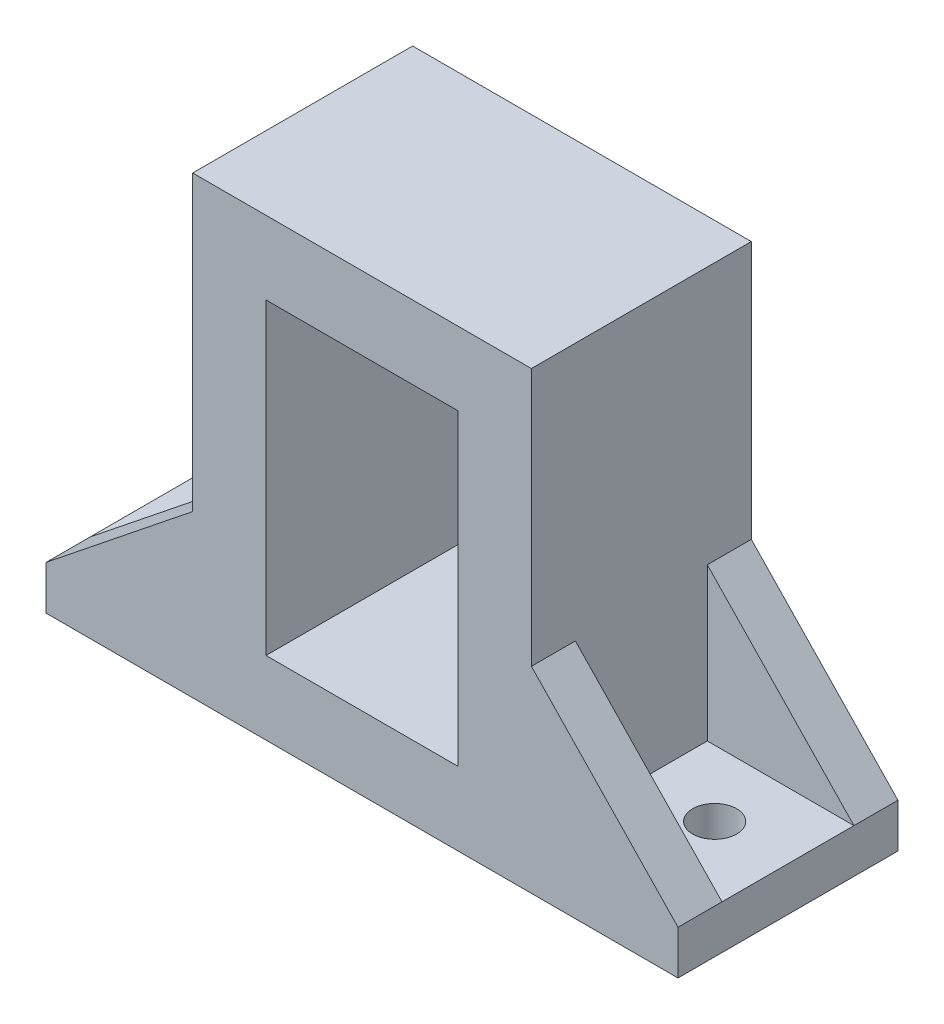
ISO-10303-21;
HEADER;
FILE_DESCRIPTION(('STEP AP214'),'2;1');
FILE_NAME('part.step','',(''),(''),'','','');
FILE_SCHEMA(('AUTOMOTIVE_DESIGN { 1 0 10303 214 1 1 1 1 }'));
ENDSEC;
DATA;
#1=APPLICATION_CONTEXT('core data for automotive mechanical design processes');
#2=APPLICATION_PROTOCOL_DEFINITION('international standard','automotive_design',2000,#1);
#3=PRODUCT_CONTEXT('',#1,'mechanical');
#4=PRODUCT('Part','Part','',(#3));
#5=PRODUCT_RELATED_PRODUCT_CATEGORY('part','',(#4));
#6=PRODUCT_DEFINITION_FORMATION('','',#4);
#7=PRODUCT_DEFINITION_CONTEXT('part definition',#1,'design');
#8=PRODUCT_DEFINITION('design','',#6,#7);
#9=PRODUCT_DEFINITION_SHAPE('','',#8);
#10=(LENGTH_UNIT() NAMED_UNIT(*) SI_UNIT(.MILLI.,.METRE.));
#11=(NAMED_UNIT(*) PLANE_ANGLE_UNIT() SI_UNIT($,.RADIAN.));
#12=(NAMED_UNIT(*) SI_UNIT($,.STERADIAN.) SOLID_ANGLE_UNIT());
#13=UNCERTAINTY_MEASURE_WITH_UNIT(LENGTH_MEASURE(1.E-05),#10,'distance_accuracy_value','');
#14=(GEOMETRIC_REPRESENTATION_CONTEXT(3) GLOBAL_UNCERTAINTY_ASSIGNED_CONTEXT((#13)) GLOBAL_UNIT_ASSIGNED_CONTEXT((#10,
#11,#12)) REPRESENTATION_CONTEXT('',''));
#15=CARTESIAN_POINT('',(0.,0.,0.));
#16=DIRECTION('',(0.,0.,1.));
#17=DIRECTION('',(1.,0.,0.));
#18=AXIS2_PLACEMENT_3D('',#15,#16,#17);
#19=CARTESIAN_POINT('',(5.,26.,15.));
#20=DIRECTION('',(-1.,0.,0.));
#21=DIRECTION('',(0.,0.,1.));
#22=AXIS2_PLACEMENT_3D('',#19,#20,#21);
#23=PLANE('',#22);
#24=DIRECTION('',(0.,-1.,0.));
#25=VECTOR('',#24,1.);
#26=CARTESIAN_POINT('',(5.,8.4092779052106,3.));
#27=LINE('',#26,#25);
#28=CARTESIAN_POINT('',(5.,8.4092779052106,3.));
#29=VERTEX_POINT('',#28);
#30=CARTESIAN_POINT('',(5.,-2.,3.));
#31=VERTEX_POINT('',#30);
#32=EDGE_CURVE('E199',#29,#31,#27,.T.);
#33=ORIENTED_EDGE('',*,*,#32,.F.);
#34=DIRECTION('',(0.,0.,1.));
#35=VECTOR('',#34,1.);
#36=CARTESIAN_POINT('',(5.,8.4092779052106,3.));
#37=LINE('',#36,#35);
#38=CARTESIAN_POINT('',(5.,8.4092779052106,0.));
#39=VERTEX_POINT('',#38);
#40=EDGE_CURVE('E197',#39,#29,#37,.T.);
#41=ORIENTED_EDGE('',*,*,#40,.F.);
#42=DIRECTION('',(0.,1.,0.));
#43=VECTOR('',#42,1.);
#44=CARTESIAN_POINT('',(5.,26.,0.));
#45=LINE('',#44,#43);
#46=CARTESIAN_POINT('',(5.,26.,0.));
#47=VERTEX_POINT('',#46);
#48=EDGE_CURVE('E180',#39,#47,#45,.T.);
#49=ORIENTED_EDGE('',*,*,#48,.T.);
#50=DIRECTION('',(0.,0.,-1.));
#51=VECTOR('',#50,1.);
#52=CARTESIAN_POINT('',(5.,26.,15.));
#53=LINE('',#52,#51);
#54=CARTESIAN_POINT('',(5.,26.,15.));
#55=VERTEX_POINT('',#54);
#56=EDGE_CURVE('E299',#55,#47,#53,.T.);
#57=ORIENTED_EDGE('',*,*,#56,.F.);
#58=DIRECTION('',(0.,1.,0.));
#59=VECTOR('',#58,1.);
#60=CARTESIAN_POINT('',(5.,26.,15.));
#61=LINE('',#60,#59);
#62=CARTESIAN_POINT('',(5.,8.4092779052106,15.));
#63=VERTEX_POINT('',#62);
#64=EDGE_CURVE('E297',#63,#55,#61,.T.);
#65=ORIENTED_EDGE('',*,*,#64,.F.);
#66=DIRECTION('',(0.,0.,1.));
#67=VECTOR('',#66,1.);
#68=CARTESIAN_POINT('',(5.,8.4092779052106,15.));
#69=LINE('',#68,#67);
#70=CARTESIAN_POINT('',(5.,8.4092779052106,12.));
#71=VERTEX_POINT('',#70);
#72=EDGE_CURVE('E191',#71,#63,#69,.T.);
#73=ORIENTED_EDGE('',*,*,#72,.F.);
#74=DIRECTION('',(0.,1.,0.));
#75=VECTOR('',#74,1.);
#76=CARTESIAN_POINT('',(5.,8.4092779052106,12.));
#77=LINE('',#76,#75);
#78=CARTESIAN_POINT('',(5.,-2.,12.));
#79=VERTEX_POINT('',#78);
#80=EDGE_CURVE('E60',#79,#71,#77,.T.);
#81=ORIENTED_EDGE('',*,*,#80,.F.);
#82=DIRECTION('',(0.,0.,1.));
#83=VECTOR('',#82,1.);
#84=CARTESIAN_POINT('',(5.,-2.,12.));
#85=LINE('',#84,#83);
#86=EDGE_CURVE('E202',#31,#79,#85,.T.);
#87=ORIENTED_EDGE('',*,*,#86,.F.);
#88=EDGE_LOOP('',(#33,#41,#49,#57,#65,#73,#81,#87));
#89=FACE_BOUND('',#88,.T.);
#90=ADVANCED_FACE('F37',(#89),#23,.F.);
#91=CARTESIAN_POINT('',(-18.1,0.,15.));
#92=DIRECTION('',(1.,0.,0.));
#93=DIRECTION('',(0.,0.,-1.));
#94=AXIS2_PLACEMENT_3D('',#91,#92,#93);
#95=PLANE('',#94);
#96=DIRECTION('',(0.,0.,-1.));
#97=VECTOR('',#96,1.);
#98=CARTESIAN_POINT('',(-18.1,6.,0.));
#99=LINE('',#98,#97);
#100=CARTESIAN_POINT('',(-18.1,6.,3.));
#101=VERTEX_POINT('',#100);
#102=CARTESIAN_POINT('',(-18.1,6.,0.));
#103=VERTEX_POINT('',#102);
#104=EDGE_CURVE('E237',#101,#103,#99,.T.);
#105=ORIENTED_EDGE('',*,*,#104,.F.);
#106=DIRECTION('',(0.,1.,0.));
#107=VECTOR('',#106,1.);
#108=CARTESIAN_POINT('',(-18.1,6.,3.));
#109=LINE('',#108,#107);
#110=CARTESIAN_POINT('',(-18.1,-2.,3.));
#111=VERTEX_POINT('',#110);
#112=EDGE_CURVE('E234',#111,#101,#109,.T.);
#113=ORIENTED_EDGE('',*,*,#112,.F.);
#114=DIRECTION('',(0.,0.,-1.));
#115=VECTOR('',#114,1.);
#116=CARTESIAN_POINT('',(-18.1,-2.,0.));
#117=LINE('',#116,#115);
#118=CARTESIAN_POINT('',(-18.1,-2.,12.));
#119=VERTEX_POINT('',#118);
#120=EDGE_CURVE('E242',#119,#111,#117,.T.);
#121=ORIENTED_EDGE('',*,*,#120,.F.);
#122=DIRECTION('',(0.,-1.,0.));
#123=VECTOR('',#122,1.);
#124=CARTESIAN_POINT('',(-18.1,6.,12.));
#125=LINE('',#124,#123);
#126=CARTESIAN_POINT('',(-18.1,6.,12.));
#127=VERTEX_POINT('',#126);
#128=EDGE_CURVE('E230',#127,#119,#125,.T.);
#129=ORIENTED_EDGE('',*,*,#128,.F.);
#130=DIRECTION('',(0.,0.,-1.));
#131=VECTOR('',#130,1.);
#132=CARTESIAN_POINT('',(-18.1,6.,15.));
#133=LINE('',#132,#131);
#134=CARTESIAN_POINT('',(-18.1,6.,15.));
#135=VERTEX_POINT('',#134);
#136=EDGE_CURVE('E232',#135,#127,#133,.T.);
#137=ORIENTED_EDGE('',*,*,#136,.F.);
#138=DIRECTION('',(0.,-1.,0.));
#139=VECTOR('',#138,1.);
#140=CARTESIAN_POINT('',(-18.1,0.,15.));
#141=LINE('',#140,#139);
#142=CARTESIAN_POINT('',(-18.1,26.,15.));
#143=VERTEX_POINT('',#142);
#144=EDGE_CURVE('E290',#143,#135,#141,.T.);
#145=ORIENTED_EDGE('',*,*,#144,.F.);
#146=DIRECTION('',(0.,0.,-1.));
#147=VECTOR('',#146,1.);
#148=CARTESIAN_POINT('',(-18.1,26.,15.));
#149=LINE('',#148,#147);
#150=CARTESIAN_POINT('',(-18.1,26.,0.));
#151=VERTEX_POINT('',#150);
#152=EDGE_CURVE('E309',#143,#151,#149,.T.);
#153=ORIENTED_EDGE('',*,*,#152,.T.);
#154=DIRECTION('',(0.,-1.,0.));
#155=VECTOR('',#154,1.);
#156=CARTESIAN_POINT('',(-18.1,0.,0.));
#157=LINE('',#156,#155);
#158=EDGE_CURVE('E286',#151,#103,#157,.T.);
#159=ORIENTED_EDGE('',*,*,#158,.T.);
#160=EDGE_LOOP('',(#105,#113,#121,#129,#137,#145,#153,#159));
#161=FACE_BOUND('',#160,.T.);
#162=ADVANCED_FACE('F39',(#161),#95,.F.);
#163=CARTESIAN_POINT('',(-28.1,-2.,0.));
#164=DIRECTION('',(0.,-1.,0.));
#165=DIRECTION('',(0.,0.,-1.));
#166=AXIS2_PLACEMENT_3D('',#163,#164,#165);
#167=PLANE('',#166);
#168=CARTESIAN_POINT('',(-23.1,-2.,7.5));
#169=DIRECTION('',(0.,1.,0.));
#170=DIRECTION('',(0.,0.,1.));
#171=AXIS2_PLACEMENT_3D('',#168,#169,#170);
#172=CIRCLE('',#171,1.5);
#173=CARTESIAN_POINT('',(-23.1,-2.,9.));
#174=VERTEX_POINT('',#173);
#175=EDGE_CURVE('E211',#174,#174,#172,.T.);
#176=ORIENTED_EDGE('',*,*,#175,.F.);
#177=EDGE_LOOP('',(#176));
#178=FACE_BOUND('',#177,.T.);
#179=DIRECTION('',(1.,0.,0.));
#180=VECTOR('',#179,1.);
#181=CARTESIAN_POINT('',(-28.1,-2.,12.));
#182=LINE('',#181,#180);
#183=CARTESIAN_POINT('',(-28.1,-2.,12.));
#184=VERTEX_POINT('',#183);
#185=EDGE_CURVE('E227',#184,#119,#182,.T.);
#186=ORIENTED_EDGE('',*,*,#185,.T.);
#187=ORIENTED_EDGE('',*,*,#120,.T.);
#188=DIRECTION('',(1.,0.,0.));
#189=VECTOR('',#188,1.);
#190=CARTESIAN_POINT('',(-28.1,-2.,3.));
#191=LINE('',#190,#189);
#192=CARTESIAN_POINT('',(-28.1,-2.,3.));
#193=VERTEX_POINT('',#192);
#194=EDGE_CURVE('E239',#193,#111,#191,.T.);
#195=ORIENTED_EDGE('',*,*,#194,.F.);
#196=DIRECTION('',(0.,0.,-1.));
#197=VECTOR('',#196,1.);
#198=CARTESIAN_POINT('',(-28.1,-2.,0.));
#199=LINE('',#198,#197);
#200=EDGE_CURVE('E249',#184,#193,#199,.T.);
#201=ORIENTED_EDGE('',*,*,#200,.F.);
#202=EDGE_LOOP('',(#186,#187,#195,#201));
#203=FACE_BOUND('',#202,.T.);
#204=ADVANCED_FACE('F341',(#178,#203),#167,.F.);
#205=CARTESIAN_POINT('',(0.,0.,15.));
#206=DIRECTION('',(0.,0.,-1.));
#207=DIRECTION('',(-1.,0.,0.));
#208=AXIS2_PLACEMENT_3D('',#205,#206,#207);
#209=PLANE('',#208);
#210=DIRECTION('',(0.,-1.,0.));
#211=VECTOR('',#210,1.);
#212=CARTESIAN_POINT('',(15.,-5.,15.));
#213=LINE('',#212,#211);
#214=CARTESIAN_POINT('',(15.,-2.,15.));
#215=VERTEX_POINT('',#214);
#216=CARTESIAN_POINT('',(15.,-5.,15.));
#217=VERTEX_POINT('',#216);
#218=EDGE_CURVE('E189',#215,#217,#213,.T.);
#219=ORIENTED_EDGE('',*,*,#218,.F.);
#220=DIRECTION('',(-0.692787513651776,0.721141775886122,0.));
#221=VECTOR('',#220,1.);
#222=CARTESIAN_POINT('',(6.80148587810971,6.53406119045497,15.));
#223=LINE('',#222,#221);
#224=EDGE_CURVE('E52',#215,#63,#223,.T.);
#225=ORIENTED_EDGE('',*,*,#224,.T.);
#226=ORIENTED_EDGE('',*,*,#64,.T.);
#227=DIRECTION('',(-1.,0.,0.));
#228=VECTOR('',#227,1.);
#229=CARTESIAN_POINT('',(0.,26.,15.));
#230=LINE('',#229,#228);
#231=EDGE_CURVE('E287',#55,#143,#230,.T.);
#232=ORIENTED_EDGE('',*,*,#231,.T.);
#233=ORIENTED_EDGE('',*,*,#144,.T.);
#234=DIRECTION('',(-0.78086880944303,-0.624695047554424,0.));
#235=VECTOR('',#234,1.);
#236=CARTESIAN_POINT('',(-9.99024390243902,12.4878048780488,15.));
#237=LINE('',#236,#235);
#238=CARTESIAN_POINT('',(-28.1,-2.,15.));
#239=VERTEX_POINT('',#238);
#240=EDGE_CURVE('E224',#135,#239,#237,.T.);
#241=ORIENTED_EDGE('',*,*,#240,.T.);
#242=DIRECTION('',(0.,1.,0.));
#243=VECTOR('',#242,1.);
#244=CARTESIAN_POINT('',(-28.1,-5.,15.));
#245=LINE('',#244,#243);
#246=CARTESIAN_POINT('',(-28.1,-5.,15.));
#247=VERTEX_POINT('',#246);
#248=EDGE_CURVE('E246',#247,#239,#245,.T.);
#249=ORIENTED_EDGE('',*,*,#248,.F.);
#250=DIRECTION('',(1.,0.,0.));
#251=VECTOR('',#250,1.);
#252=CARTESIAN_POINT('',(-18.1,-5.,15.));
#253=LINE('',#252,#251);
#254=EDGE_CURVE('E294',#247,#217,#253,.T.);
#255=ORIENTED_EDGE('',*,*,#254,.T.);
#256=EDGE_LOOP('',(#219,#225,#226,#232,#233,#241,#249,#255));
#257=FACE_BOUND('',#256,.T.);
#258=DIRECTION('',(0.,1.,0.));
#259=VECTOR('',#258,1.);
#260=CARTESIAN_POINT('',(0.,21.,15.));
#261=LINE('',#260,#259);
#262=CARTESIAN_POINT('',(0.,0.,15.));
#263=VERTEX_POINT('',#262);
#264=CARTESIAN_POINT('',(0.,21.,15.));
#265=VERTEX_POINT('',#264);
#266=EDGE_CURVE('E256',#263,#265,#261,.T.);
#267=ORIENTED_EDGE('',*,*,#266,.F.);
#268=DIRECTION('',(1.,0.,0.));
#269=VECTOR('',#268,1.);
#270=CARTESIAN_POINT('',(0.,0.,15.));
#271=LINE('',#270,#269);
#272=CARTESIAN_POINT('',(-13.1,0.,15.));
#273=VERTEX_POINT('',#272);
#274=EDGE_CURVE('E264',#273,#263,#271,.T.);
#275=ORIENTED_EDGE('',*,*,#274,.F.);
#276=DIRECTION('',(0.,-1.,0.));
#277=VECTOR('',#276,1.);
#278=CARTESIAN_POINT('',(-13.1,0.,15.));
#279=LINE('',#278,#277);
#280=CARTESIAN_POINT('',(-13.1,21.,15.));
#281=VERTEX_POINT('',#280);
#282=EDGE_CURVE('E261',#281,#273,#279,.T.);
#283=ORIENTED_EDGE('',*,*,#282,.F.);
#284=DIRECTION('',(-1.,0.,0.));
#285=VECTOR('',#284,1.);
#286=CARTESIAN_POINT('',(-13.1,21.,15.));
#287=LINE('',#286,#285);
#288=EDGE_CURVE('E258',#265,#281,#287,.T.);
#289=ORIENTED_EDGE('',*,*,#288,.F.);
#290=EDGE_LOOP('',(#267,#275,#283,#289));
#291=FACE_BOUND('',#290,.T.);
#292=ADVANCED_FACE('F355',(#257,#291),#209,.F.);
#293=CARTESIAN_POINT('',(0.,0.,0.));
#294=DIRECTION('',(0.,0.,-1.));
#295=DIRECTION('',(-1.,0.,0.));
#296=AXIS2_PLACEMENT_3D('',#293,#294,#295);
#297=PLANE('',#296);
#298=DIRECTION('',(-0.692787513651776,0.721141775886122,0.));
#299=VECTOR('',#298,1.);
#300=CARTESIAN_POINT('',(5.,8.4092779052106,0.));
#301=LINE('',#300,#299);
#302=CARTESIAN_POINT('',(15.,-2.,0.));
#303=VERTEX_POINT('',#302);
#304=EDGE_CURVE('E163',#303,#39,#301,.T.);
#305=ORIENTED_EDGE('',*,*,#304,.F.);
#306=DIRECTION('',(0.,1.,0.));
#307=VECTOR('',#306,1.);
#308=CARTESIAN_POINT('',(15.,8.4092779052106,0.));
#309=LINE('',#308,#307);
#310=CARTESIAN_POINT('',(15.,-5.,0.));
#311=VERTEX_POINT('',#310);
#312=EDGE_CURVE('E177',#311,#303,#309,.T.);
#313=ORIENTED_EDGE('',*,*,#312,.F.);
#314=DIRECTION('',(1.,0.,0.));
#315=VECTOR('',#314,1.);
#316=CARTESIAN_POINT('',(-18.1,-5.,0.));
#317=LINE('',#316,#315);
#318=CARTESIAN_POINT('',(-28.1,-5.,0.));
#319=VERTEX_POINT('',#318);
#320=EDGE_CURVE('E302',#319,#311,#317,.T.);
#321=ORIENTED_EDGE('',*,*,#320,.F.);
#322=DIRECTION('',(0.,-1.,0.));
#323=VECTOR('',#322,1.);
#324=CARTESIAN_POINT('',(-28.1,-5.,0.));
#325=LINE('',#324,#323);
#326=CARTESIAN_POINT('',(-28.1,-2.,0.));
#327=VERTEX_POINT('',#326);
#328=EDGE_CURVE('E252',#327,#319,#325,.T.);
#329=ORIENTED_EDGE('',*,*,#328,.F.);
#330=DIRECTION('',(-0.78086880944303,-0.624695047554424,0.));
#331=VECTOR('',#330,1.);
#332=CARTESIAN_POINT('',(-18.1,6.,0.));
#333=LINE('',#332,#331);
#334=EDGE_CURVE('E215',#103,#327,#333,.T.);
#335=ORIENTED_EDGE('',*,*,#334,.F.);
#336=ORIENTED_EDGE('',*,*,#158,.F.);
#337=DIRECTION('',(-1.,0.,0.));
#338=VECTOR('',#337,1.);
#339=CARTESIAN_POINT('',(0.,26.,0.));
#340=LINE('',#339,#338);
#341=EDGE_CURVE('E291',#47,#151,#340,.T.);
#342=ORIENTED_EDGE('',*,*,#341,.F.);
#343=ORIENTED_EDGE('',*,*,#48,.F.);
#344=EDGE_LOOP('',(#305,#313,#321,#329,#335,#336,#342,#343));
#345=FACE_BOUND('',#344,.T.);
#346=DIRECTION('',(1.,0.,0.));
#347=VECTOR('',#346,1.);
#348=CARTESIAN_POINT('',(0.,0.,0.));
#349=LINE('',#348,#347);
#350=CARTESIAN_POINT('',(-13.1,0.,0.));
#351=VERTEX_POINT('',#350);
#352=CARTESIAN_POINT('',(0.,0.,0.));
#353=VERTEX_POINT('',#352);
#354=EDGE_CURVE('E259',#351,#353,#349,.T.);
#355=ORIENTED_EDGE('',*,*,#354,.T.);
#356=DIRECTION('',(0.,1.,0.));
#357=VECTOR('',#356,1.);
#358=CARTESIAN_POINT('',(0.,21.,0.));
#359=LINE('',#358,#357);
#360=CARTESIAN_POINT('',(0.,21.,0.));
#361=VERTEX_POINT('',#360);
#362=EDGE_CURVE('E254',#353,#361,#359,.T.);
#363=ORIENTED_EDGE('',*,*,#362,.T.);
#364=DIRECTION('',(-1.,0.,0.));
#365=VECTOR('',#364,1.);
#366=CARTESIAN_POINT('',(-13.1,21.,0.));
#367=LINE('',#366,#365);
#368=CARTESIAN_POINT('',(-13.1,21.,0.));
#369=VERTEX_POINT('',#368);
#370=EDGE_CURVE('E269',#361,#369,#367,.T.);
#371=ORIENTED_EDGE('',*,*,#370,.T.);
#372=DIRECTION('',(0.,-1.,0.));
#373=VECTOR('',#372,1.);
#374=CARTESIAN_POINT('',(-13.1,0.,0.));
#375=LINE('',#374,#373);
#376=EDGE_CURVE('E272',#369,#351,#375,.T.);
#377=ORIENTED_EDGE('',*,*,#376,.T.);
#378=EDGE_LOOP('',(#355,#363,#371,#377));
#379=FACE_BOUND('',#378,.T.);
#380=ADVANCED_FACE('F174',(#345,#379),#297,.T.);
#381=CARTESIAN_POINT('',(-18.1,-5.,15.));
#382=DIRECTION('',(0.,1.,0.));
#383=DIRECTION('',(0.,0.,1.));
#384=AXIS2_PLACEMENT_3D('',#381,#382,#383);
#385=PLANE('',#384);
#386=CARTESIAN_POINT('',(10.,-5.,7.5));
#387=DIRECTION('',(0.,1.,0.));
#388=DIRECTION('',(0.,0.,1.));
#389=AXIS2_PLACEMENT_3D('',#386,#387,#388);
#390=CIRCLE('',#389,1.5);
#391=CARTESIAN_POINT('',(10.,-5.,9.));
#392=VERTEX_POINT('',#391);
#393=EDGE_CURVE('E182',#392,#392,#390,.T.);
#394=ORIENTED_EDGE('',*,*,#393,.T.);
#395=EDGE_LOOP('',(#394));
#396=FACE_BOUND('',#395,.T.);
#397=CARTESIAN_POINT('',(-23.1,-5.,7.5));
#398=DIRECTION('',(0.,1.,0.));
#399=DIRECTION('',(0.,0.,1.));
#400=AXIS2_PLACEMENT_3D('',#397,#398,#399);
#401=CIRCLE('',#400,1.5);
#402=CARTESIAN_POINT('',(-23.1,-5.,9.));
#403=VERTEX_POINT('',#402);
#404=EDGE_CURVE('E214',#403,#403,#401,.T.);
#405=ORIENTED_EDGE('',*,*,#404,.T.);
#406=EDGE_LOOP('',(#405));
#407=FACE_BOUND('',#406,.T.);
#408=ORIENTED_EDGE('',*,*,#320,.T.);
#409=DIRECTION('',(0.,0.,-1.));
#410=VECTOR('',#409,1.);
#411=CARTESIAN_POINT('',(15.,-5.,15.));
#412=LINE('',#411,#410);
#413=EDGE_CURVE('E186',#217,#311,#412,.T.);
#414=ORIENTED_EDGE('',*,*,#413,.F.);
#415=ORIENTED_EDGE('',*,*,#254,.F.);
#416=DIRECTION('',(0.,0.,1.));
#417=VECTOR('',#416,1.);
#418=CARTESIAN_POINT('',(-28.1,-5.,0.));
#419=LINE('',#418,#417);
#420=EDGE_CURVE('E243',#319,#247,#419,.T.);
#421=ORIENTED_EDGE('',*,*,#420,.F.);
#422=EDGE_LOOP('',(#408,#414,#415,#421));
#423=FACE_BOUND('',#422,.T.);
#424=ADVANCED_FACE('F317',(#396,#407,#423),#385,.F.);
#425=CARTESIAN_POINT('',(0.,26.,15.));
#426=DIRECTION('',(0.,-1.,0.));
#427=DIRECTION('',(0.,0.,-1.));
#428=AXIS2_PLACEMENT_3D('',#425,#426,#427);
#429=PLANE('',#428);
#430=ORIENTED_EDGE('',*,*,#341,.T.);
#431=ORIENTED_EDGE('',*,*,#152,.F.);
#432=ORIENTED_EDGE('',*,*,#231,.F.);
#433=ORIENTED_EDGE('',*,*,#56,.T.);
#434=EDGE_LOOP('',(#430,#431,#432,#433));
#435=FACE_BOUND('',#434,.T.);
#436=ADVANCED_FACE('F345',(#435),#429,.F.);
#437=CARTESIAN_POINT('',(0.,21.,15.));
#438=DIRECTION('',(-1.,0.,0.));
#439=DIRECTION('',(0.,-1.,0.));
#440=AXIS2_PLACEMENT_3D('',#437,#438,#439);
#441=PLANE('',#440);
#442=ORIENTED_EDGE('',*,*,#362,.F.);
#443=DIRECTION('',(0.,0.,-1.));
#444=VECTOR('',#443,1.);
#445=CARTESIAN_POINT('',(0.,0.,15.));
#446=LINE('',#445,#444);
#447=EDGE_CURVE('E266',#263,#353,#446,.T.);
#448=ORIENTED_EDGE('',*,*,#447,.F.);
#449=ORIENTED_EDGE('',*,*,#266,.T.);
#450=DIRECTION('',(0.,0.,-1.));
#451=VECTOR('',#450,1.);
#452=CARTESIAN_POINT('',(0.,21.,15.));
#453=LINE('',#452,#451);
#454=EDGE_CURVE('E283',#265,#361,#453,.T.);
#455=ORIENTED_EDGE('',*,*,#454,.T.);
#456=EDGE_LOOP('',(#442,#448,#449,#455));
#457=FACE_BOUND('',#456,.T.);
#458=ADVANCED_FACE('F353',(#457),#441,.T.);
#459=CARTESIAN_POINT('',(-13.1,21.,15.));
#460=DIRECTION('',(0.,-1.,0.));
#461=DIRECTION('',(1.,0.,0.));
#462=AXIS2_PLACEMENT_3D('',#459,#460,#461);
#463=PLANE('',#462);
#464=ORIENTED_EDGE('',*,*,#370,.F.);
#465=ORIENTED_EDGE('',*,*,#454,.F.);
#466=ORIENTED_EDGE('',*,*,#288,.T.);
#467=DIRECTION('',(0.,0.,-1.));
#468=VECTOR('',#467,1.);
#469=CARTESIAN_POINT('',(-13.1,21.,15.));
#470=LINE('',#469,#468);
#471=EDGE_CURVE('E281',#281,#369,#470,.T.);
#472=ORIENTED_EDGE('',*,*,#471,.T.);
#473=EDGE_LOOP('',(#464,#465,#466,#472));
#474=FACE_BOUND('',#473,.T.);
#475=ADVANCED_FACE('F414',(#474),#463,.T.);
#476=CARTESIAN_POINT('',(-13.1,0.,15.));
#477=DIRECTION('',(1.,0.,0.));
#478=DIRECTION('',(0.,0.,-1.));
#479=AXIS2_PLACEMENT_3D('',#476,#477,#478);
#480=PLANE('',#479);
#481=ORIENTED_EDGE('',*,*,#376,.F.);
#482=ORIENTED_EDGE('',*,*,#471,.F.);
#483=ORIENTED_EDGE('',*,*,#282,.T.);
#484=DIRECTION('',(0.,0.,-1.));
#485=VECTOR('',#484,1.);
#486=CARTESIAN_POINT('',(-13.1,0.,15.));
#487=LINE('',#486,#485);
#488=EDGE_CURVE('E279',#273,#351,#487,.T.);
#489=ORIENTED_EDGE('',*,*,#488,.T.);
#490=EDGE_LOOP('',(#481,#482,#483,#489));
#491=FACE_BOUND('',#490,.T.);
#492=ADVANCED_FACE('F410',(#491),#480,.T.);
#493=CARTESIAN_POINT('',(0.,0.,15.));
#494=DIRECTION('',(0.,1.,0.));
#495=DIRECTION('',(-1.,0.,0.));
#496=AXIS2_PLACEMENT_3D('',#493,#494,#495);
#497=PLANE('',#496);
#498=ORIENTED_EDGE('',*,*,#354,.F.);
#499=ORIENTED_EDGE('',*,*,#488,.F.);
#500=ORIENTED_EDGE('',*,*,#274,.T.);
#501=ORIENTED_EDGE('',*,*,#447,.T.);
#502=EDGE_LOOP('',(#498,#499,#500,#501));
#503=FACE_BOUND('',#502,.T.);
#504=ADVANCED_FACE('F404',(#503),#497,.T.);
#505=CARTESIAN_POINT('',(-28.1,0.,0.));
#506=DIRECTION('',(-1.,0.,0.));
#507=DIRECTION('',(0.,0.,1.));
#508=AXIS2_PLACEMENT_3D('',#505,#506,#507);
#509=PLANE('',#508);
#510=DIRECTION('',(0.,0.,-1.));
#511=VECTOR('',#510,1.);
#512=CARTESIAN_POINT('',(-28.1,-2.,19.));
#513=LINE('',#512,#511);
#514=EDGE_CURVE('E217',#193,#327,#513,.T.);
#515=ORIENTED_EDGE('',*,*,#514,.T.);
#516=ORIENTED_EDGE('',*,*,#328,.T.);
#517=ORIENTED_EDGE('',*,*,#420,.T.);
#518=ORIENTED_EDGE('',*,*,#248,.T.);
#519=EDGE_CURVE('E220',#239,#184,#513,.T.);
#520=ORIENTED_EDGE('',*,*,#519,.T.);
#521=ORIENTED_EDGE('',*,*,#200,.T.);
#522=EDGE_LOOP('',(#515,#516,#517,#518,#520,#521));
#523=FACE_BOUND('',#522,.T.);
#524=ADVANCED_FACE('F383',(#523),#509,.T.);
#525=CARTESIAN_POINT('',(-28.1,6.,3.));
#526=DIRECTION('',(0.,0.,-1.));
#527=DIRECTION('',(-1.,0.,0.));
#528=AXIS2_PLACEMENT_3D('',#525,#526,#527);
#529=PLANE('',#528);
#530=ORIENTED_EDGE('',*,*,#112,.T.);
#531=DIRECTION('',(-0.78086880944303,-0.624695047554424,0.));
#532=VECTOR('',#531,1.);
#533=CARTESIAN_POINT('',(-24.1975609756098,1.12195121951219,3.));
#534=LINE('',#533,#532);
#535=EDGE_CURVE('E221',#101,#193,#534,.T.);
#536=ORIENTED_EDGE('',*,*,#535,.T.);
#537=ORIENTED_EDGE('',*,*,#194,.T.);
#538=EDGE_LOOP('',(#530,#536,#537));
#539=FACE_BOUND('',#538,.T.);
#540=ADVANCED_FACE('F389',(#539),#529,.F.);
#541=CARTESIAN_POINT('',(-28.1,6.,12.));
#542=DIRECTION('',(0.,0.,1.));
#543=DIRECTION('',(1.,0.,0.));
#544=AXIS2_PLACEMENT_3D('',#541,#542,#543);
#545=PLANE('',#544);
#546=ORIENTED_EDGE('',*,*,#185,.F.);
#547=DIRECTION('',(0.78086880944303,0.624695047554424,0.));
#548=VECTOR('',#547,1.);
#549=CARTESIAN_POINT('',(-24.1975609756098,1.12195121951219,12.));
#550=LINE('',#549,#548);
#551=EDGE_CURVE('E312',#184,#127,#550,.T.);
#552=ORIENTED_EDGE('',*,*,#551,.T.);
#553=ORIENTED_EDGE('',*,*,#128,.T.);
#554=EDGE_LOOP('',(#546,#552,#553));
#555=FACE_BOUND('',#554,.T.);
#556=ADVANCED_FACE('F393',(#555),#545,.F.);
#557=CARTESIAN_POINT('',(-18.1,6.,19.));
#558=DIRECTION('',(0.624695047554424,-0.78086880944303,0.));
#559=DIRECTION('',(0.78086880944303,0.624695047554424,0.));
#560=AXIS2_PLACEMENT_3D('',#557,#558,#559);
#561=PLANE('',#560);
#562=ORIENTED_EDGE('',*,*,#136,.T.);
#563=ORIENTED_EDGE('',*,*,#551,.F.);
#564=ORIENTED_EDGE('',*,*,#519,.F.);
#565=ORIENTED_EDGE('',*,*,#240,.F.);
#566=EDGE_LOOP('',(#562,#563,#564,#565));
#567=FACE_BOUND('',#566,.T.);
#568=ADVANCED_FACE('F333',(#567),#561,.F.);
#569=ORIENTED_EDGE('',*,*,#104,.T.);
#570=ORIENTED_EDGE('',*,*,#334,.T.);
#571=ORIENTED_EDGE('',*,*,#514,.F.);
#572=ORIENTED_EDGE('',*,*,#535,.F.);
#573=EDGE_LOOP('',(#569,#570,#571,#572));
#574=FACE_BOUND('',#573,.T.);
#575=ADVANCED_FACE('F323',(#574),#561,.F.);
#576=CARTESIAN_POINT('',(-23.1,-21.,7.5));
#577=DIRECTION('',(0.,1.,0.));
#578=DIRECTION('',(0.,0.,1.));
#579=AXIS2_PLACEMENT_3D('',#576,#577,#578);
#580=CYLINDRICAL_SURFACE('',#579,1.5);
#581=ORIENTED_EDGE('',*,*,#175,.T.);
#582=EDGE_LOOP('',(#581));
#583=FACE_BOUND('',#582,.T.);
#584=ORIENTED_EDGE('',*,*,#404,.F.);
#585=EDGE_LOOP('',(#584));
#586=FACE_BOUND('',#585,.T.);
#587=ADVANCED_FACE('F320',(#583,#586),#580,.F.);
#588=CARTESIAN_POINT('',(15.,8.4092779052106,3.));
#589=DIRECTION('',(0.,0.,-1.));
#590=DIRECTION('',(0.,1.,0.));
#591=AXIS2_PLACEMENT_3D('',#588,#589,#590);
#592=PLANE('',#591);
#593=DIRECTION('',(-1.,0.,0.));
#594=VECTOR('',#593,1.);
#595=CARTESIAN_POINT('',(15.,-2.,3.));
#596=LINE('',#595,#594);
#597=CARTESIAN_POINT('',(15.,-2.,3.));
#598=VERTEX_POINT('',#597);
#599=EDGE_CURVE('E208',#598,#31,#596,.T.);
#600=ORIENTED_EDGE('',*,*,#599,.F.);
#601=DIRECTION('',(-0.692787513651776,0.721141775886122,0.));
#602=VECTOR('',#601,1.);
#603=CARTESIAN_POINT('',(9.7995453907181,3.41329772614488,3.));
#604=LINE('',#603,#602);
#605=EDGE_CURVE('E166',#598,#29,#604,.T.);
#606=ORIENTED_EDGE('',*,*,#605,.T.);
#607=ORIENTED_EDGE('',*,*,#32,.T.);
#608=EDGE_LOOP('',(#600,#606,#607));
#609=FACE_BOUND('',#608,.T.);
#610=ADVANCED_FACE('F322',(#609),#592,.F.);
#611=CARTESIAN_POINT('',(15.,-2.,12.));
#612=DIRECTION('',(0.,-1.,0.));
#613=DIRECTION('',(0.,0.,-1.));
#614=AXIS2_PLACEMENT_3D('',#611,#612,#613);
#615=PLANE('',#614);
#616=CARTESIAN_POINT('',(10.,-2.,7.5));
#617=DIRECTION('',(0.,1.,0.));
#618=DIRECTION('',(0.,0.,1.));
#619=AXIS2_PLACEMENT_3D('',#616,#617,#618);
#620=CIRCLE('',#619,1.5);
#621=CARTESIAN_POINT('',(10.,-2.,9.));
#622=VERTEX_POINT('',#621);
#623=EDGE_CURVE('E359',#622,#622,#620,.T.);
#624=ORIENTED_EDGE('',*,*,#623,.F.);
#625=EDGE_LOOP('',(#624));
#626=FACE_BOUND('',#625,.T.);
#627=ORIENTED_EDGE('',*,*,#86,.T.);
#628=DIRECTION('',(-1.,0.,0.));
#629=VECTOR('',#628,1.);
#630=CARTESIAN_POINT('',(15.,-2.,12.));
#631=LINE('',#630,#629);
#632=CARTESIAN_POINT('',(15.,-2.,12.));
#633=VERTEX_POINT('',#632);
#634=EDGE_CURVE('E196',#633,#79,#631,.T.);
#635=ORIENTED_EDGE('',*,*,#634,.F.);
#636=DIRECTION('',(0.,0.,1.));
#637=VECTOR('',#636,1.);
#638=CARTESIAN_POINT('',(15.,-2.,12.));
#639=LINE('',#638,#637);
#640=EDGE_CURVE('E187',#598,#633,#639,.T.);
#641=ORIENTED_EDGE('',*,*,#640,.F.);
#642=ORIENTED_EDGE('',*,*,#599,.T.);
#643=EDGE_LOOP('',(#627,#635,#641,#642));
#644=FACE_BOUND('',#643,.T.);
#645=ADVANCED_FACE('F330',(#626,#644),#615,.F.);
#646=CARTESIAN_POINT('',(15.,8.4092779052106,12.));
#647=DIRECTION('',(0.,0.,1.));
#648=DIRECTION('',(1.,0.,0.));
#649=AXIS2_PLACEMENT_3D('',#646,#647,#648);
#650=PLANE('',#649);
#651=ORIENTED_EDGE('',*,*,#80,.T.);
#652=DIRECTION('',(0.692787513651776,-0.721141775886122,0.));
#653=VECTOR('',#652,1.);
#654=CARTESIAN_POINT('',(9.7995453907181,3.41329772614488,12.));
#655=LINE('',#654,#653);
#656=EDGE_CURVE('E181',#71,#633,#655,.T.);
#657=ORIENTED_EDGE('',*,*,#656,.T.);
#658=ORIENTED_EDGE('',*,*,#634,.T.);
#659=EDGE_LOOP('',(#651,#657,#658));
#660=FACE_BOUND('',#659,.T.);
#661=ADVANCED_FACE('F447',(#660),#650,.F.);
#662=CARTESIAN_POINT('',(15.,0.,0.));
#663=DIRECTION('',(-1.,0.,0.));
#664=DIRECTION('',(0.,0.,1.));
#665=AXIS2_PLACEMENT_3D('',#662,#663,#664);
#666=PLANE('',#665);
#667=ORIENTED_EDGE('',*,*,#312,.T.);
#668=DIRECTION('',(0.,0.,1.));
#669=VECTOR('',#668,1.);
#670=CARTESIAN_POINT('',(15.,-2.,0.));
#671=LINE('',#670,#669);
#672=EDGE_CURVE('E11',#303,#598,#671,.T.);
#673=ORIENTED_EDGE('',*,*,#672,.T.);
#674=ORIENTED_EDGE('',*,*,#640,.T.);
#675=EDGE_CURVE('E41',#633,#215,#671,.T.);
#676=ORIENTED_EDGE('',*,*,#675,.T.);
#677=ORIENTED_EDGE('',*,*,#218,.T.);
#678=ORIENTED_EDGE('',*,*,#413,.T.);
#679=EDGE_LOOP('',(#667,#673,#674,#676,#677,#678));
#680=FACE_BOUND('',#679,.T.);
#681=ADVANCED_FACE('F184',(#680),#666,.F.);
#682=CARTESIAN_POINT('',(5.,8.4092779052106,23.));
#683=DIRECTION('',(-0.721141775886122,-0.692787513651776,0.));
#684=DIRECTION('',(0.692787513651776,-0.721141775886122,0.));
#685=AXIS2_PLACEMENT_3D('',#682,#683,#684);
#686=PLANE('',#685);
#687=ORIENTED_EDGE('',*,*,#675,.F.);
#688=ORIENTED_EDGE('',*,*,#656,.F.);
#689=ORIENTED_EDGE('',*,*,#72,.T.);
#690=ORIENTED_EDGE('',*,*,#224,.F.);
#691=EDGE_LOOP('',(#687,#688,#689,#690));
#692=FACE_BOUND('',#691,.T.);
#693=ADVANCED_FACE('F462',(#692),#686,.F.);
#694=ORIENTED_EDGE('',*,*,#672,.F.);
#695=ORIENTED_EDGE('',*,*,#304,.T.);
#696=ORIENTED_EDGE('',*,*,#40,.T.);
#697=ORIENTED_EDGE('',*,*,#605,.F.);
#698=EDGE_LOOP('',(#694,#695,#696,#697));
#699=FACE_BOUND('',#698,.T.);
#700=ADVANCED_FACE('F162',(#699),#686,.F.);
#701=CARTESIAN_POINT('',(10.,-25.,7.5));
#702=DIRECTION('',(0.,1.,0.));
#703=DIRECTION('',(0.,0.,1.));
#704=AXIS2_PLACEMENT_3D('',#701,#702,#703);
#705=CYLINDRICAL_SURFACE('',#704,1.5);
#706=ORIENTED_EDGE('',*,*,#623,.T.);
#707=EDGE_LOOP('',(#706));
#708=FACE_BOUND('',#707,.T.);
#709=ORIENTED_EDGE('',*,*,#393,.F.);
#710=EDGE_LOOP('',(#709));
#711=FACE_BOUND('',#710,.T.);
#712=ADVANCED_FACE('F480',(#708,#711),#705,.F.);
#713=CLOSED_SHELL('',(#90,#162,#204,#292,#380,#424,#436,#458,#475,#492,#504,#524,#540,#556,#568,
#575,#587,#610,#645,#661,#681,#693,#700,#712));
#714=MANIFOLD_SOLID_BREP('B2',#713);
#715=ADVANCED_BREP_SHAPE_REPRESENTATION('',(#18,#714),#14);
#716=SHAPE_DEFINITION_REPRESENTATION(#9,#715);
ENDSEC;
END-ISO-10303-21;
